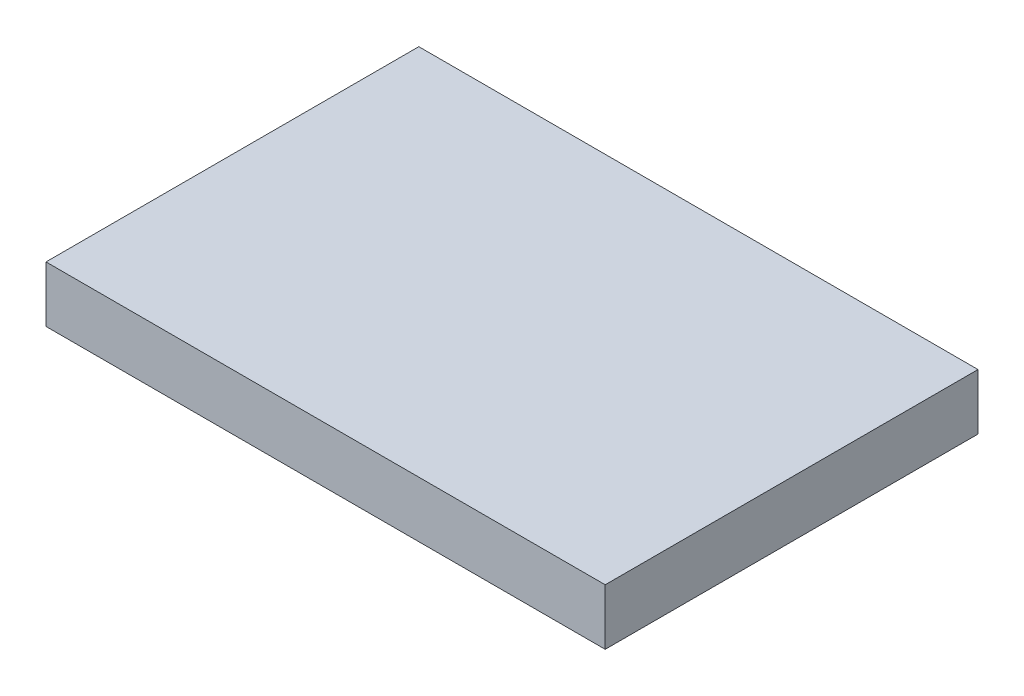
ISO-10303-21;
HEADER;
FILE_DESCRIPTION(('STEP AP214'),'2;1');
FILE_NAME('part.step','',(''),(''),'','','');
FILE_SCHEMA(('AUTOMOTIVE_DESIGN { 1 0 10303 214 1 1 1 1 }'));
ENDSEC;
DATA;
#1=APPLICATION_CONTEXT('core data for automotive mechanical design processes');
#2=APPLICATION_PROTOCOL_DEFINITION('international standard','automotive_design',2000,#1);
#3=PRODUCT_CONTEXT('',#1,'mechanical');
#4=PRODUCT('Part','Part','',(#3));
#5=PRODUCT_RELATED_PRODUCT_CATEGORY('part','',(#4));
#6=PRODUCT_DEFINITION_FORMATION('','',#4);
#7=PRODUCT_DEFINITION_CONTEXT('part definition',#1,'design');
#8=PRODUCT_DEFINITION('design','',#6,#7);
#9=PRODUCT_DEFINITION_SHAPE('','',#8);
#10=(LENGTH_UNIT() NAMED_UNIT(*) SI_UNIT(.MILLI.,.METRE.));
#11=(NAMED_UNIT(*) PLANE_ANGLE_UNIT() SI_UNIT($,.RADIAN.));
#12=(NAMED_UNIT(*) SI_UNIT($,.STERADIAN.) SOLID_ANGLE_UNIT());
#13=UNCERTAINTY_MEASURE_WITH_UNIT(LENGTH_MEASURE(1.E-05),#10,'distance_accuracy_value','');
#14=(GEOMETRIC_REPRESENTATION_CONTEXT(3) GLOBAL_UNCERTAINTY_ASSIGNED_CONTEXT((#13)) GLOBAL_UNIT_ASSIGNED_CONTEXT((#10,
#11,#12)) REPRESENTATION_CONTEXT('',''));
#15=CARTESIAN_POINT('',(0.,0.,0.));
#16=DIRECTION('',(0.,0.,1.));
#17=DIRECTION('',(1.,0.,0.));
#18=AXIS2_PLACEMENT_3D('',#15,#16,#17);
#19=CARTESIAN_POINT('',(-38.0220892526667,3.,4.97529392086932));
#20=DIRECTION('',(1.,0.,0.));
#21=DIRECTION('',(0.,0.,-1.));
#22=AXIS2_PLACEMENT_3D('',#19,#20,#21);
#23=PLANE('',#22);
#24=DIRECTION('',(0.,0.,1.));
#25=VECTOR('',#24,1.);
#26=CARTESIAN_POINT('',(-38.0220892526667,0.,4.97529392086932));
#27=LINE('',#26,#25);
#28=CARTESIAN_POINT('',(-38.0220892526667,0.,4.97529392086932));
#29=VERTEX_POINT('',#28);
#30=CARTESIAN_POINT('',(-38.0220892526667,0.,24.9752939208693));
#31=VERTEX_POINT('',#30);
#32=EDGE_CURVE('E93',#29,#31,#27,.T.);
#33=ORIENTED_EDGE('',*,*,#32,.T.);
#34=DIRECTION('',(0.,-1.,0.));
#35=VECTOR('',#34,1.);
#36=CARTESIAN_POINT('',(-38.0220892526667,3.,24.9752939208693));
#37=LINE('',#36,#35);
#38=CARTESIAN_POINT('',(-38.0220892526667,3.,24.9752939208693));
#39=VERTEX_POINT('',#38);
#40=EDGE_CURVE('E11',#39,#31,#37,.T.);
#41=ORIENTED_EDGE('',*,*,#40,.F.);
#42=DIRECTION('',(0.,0.,1.));
#43=VECTOR('',#42,1.);
#44=CARTESIAN_POINT('',(-38.0220892526667,3.,4.97529392086932));
#45=LINE('',#44,#43);
#46=CARTESIAN_POINT('',(-38.0220892526667,3.,4.97529392086932));
#47=VERTEX_POINT('',#46);
#48=EDGE_CURVE('E81',#47,#39,#45,.T.);
#49=ORIENTED_EDGE('',*,*,#48,.F.);
#50=DIRECTION('',(0.,-1.,0.));
#51=VECTOR('',#50,1.);
#52=CARTESIAN_POINT('',(-38.0220892526667,3.,4.97529392086932));
#53=LINE('',#52,#51);
#54=EDGE_CURVE('E89',#47,#29,#53,.T.);
#55=ORIENTED_EDGE('',*,*,#54,.T.);
#56=EDGE_LOOP('',(#33,#41,#49,#55));
#57=FACE_BOUND('',#56,.T.);
#58=ADVANCED_FACE('F30',(#57),#23,.F.);
#59=CARTESIAN_POINT('',(-38.0220892526667,3.,24.9752939208693));
#60=DIRECTION('',(0.,0.,-1.));
#61=DIRECTION('',(-1.,0.,0.));
#62=AXIS2_PLACEMENT_3D('',#59,#60,#61);
#63=PLANE('',#62);
#64=DIRECTION('',(1.,0.,0.));
#65=VECTOR('',#64,1.);
#66=CARTESIAN_POINT('',(-38.0220892526667,0.,24.9752939208693));
#67=LINE('',#66,#65);
#68=CARTESIAN_POINT('',(-8.02208925266672,0.,24.9752939208693));
#69=VERTEX_POINT('',#68);
#70=EDGE_CURVE('E85',#31,#69,#67,.T.);
#71=ORIENTED_EDGE('',*,*,#70,.T.);
#72=DIRECTION('',(0.,-1.,0.));
#73=VECTOR('',#72,1.);
#74=CARTESIAN_POINT('',(-8.02208925266672,3.,24.9752939208693));
#75=LINE('',#74,#73);
#76=CARTESIAN_POINT('',(-8.02208925266672,3.,24.9752939208693));
#77=VERTEX_POINT('',#76);
#78=EDGE_CURVE('E38',#77,#69,#75,.T.);
#79=ORIENTED_EDGE('',*,*,#78,.F.);
#80=DIRECTION('',(1.,0.,0.));
#81=VECTOR('',#80,1.);
#82=CARTESIAN_POINT('',(-38.0220892526667,3.,24.9752939208693));
#83=LINE('',#82,#81);
#84=EDGE_CURVE('E76',#39,#77,#83,.T.);
#85=ORIENTED_EDGE('',*,*,#84,.F.);
#86=ORIENTED_EDGE('',*,*,#40,.T.);
#87=EDGE_LOOP('',(#71,#79,#85,#86));
#88=FACE_BOUND('',#87,.T.);
#89=ADVANCED_FACE('F84',(#88),#63,.F.);
#90=CARTESIAN_POINT('',(-8.02208925266673,3.,4.97529392086932));
#91=DIRECTION('',(-1.,0.,0.));
#92=DIRECTION('',(0.,0.,1.));
#93=AXIS2_PLACEMENT_3D('',#90,#91,#92);
#94=PLANE('',#93);
#95=DIRECTION('',(0.,0.,-1.));
#96=VECTOR('',#95,1.);
#97=CARTESIAN_POINT('',(-8.02208925266673,0.,4.97529392086932));
#98=LINE('',#97,#96);
#99=CARTESIAN_POINT('',(-8.02208925266673,0.,4.97529392086932));
#100=VERTEX_POINT('',#99);
#101=EDGE_CURVE('E63',#69,#100,#98,.T.);
#102=ORIENTED_EDGE('',*,*,#101,.T.);
#103=DIRECTION('',(0.,-1.,0.));
#104=VECTOR('',#103,1.);
#105=CARTESIAN_POINT('',(-8.02208925266673,3.,4.97529392086932));
#106=LINE('',#105,#104);
#107=CARTESIAN_POINT('',(-8.02208925266673,3.,4.97529392086932));
#108=VERTEX_POINT('',#107);
#109=EDGE_CURVE('E86',#108,#100,#106,.T.);
#110=ORIENTED_EDGE('',*,*,#109,.F.);
#111=DIRECTION('',(0.,0.,-1.));
#112=VECTOR('',#111,1.);
#113=CARTESIAN_POINT('',(-8.02208925266673,3.,4.97529392086932));
#114=LINE('',#113,#112);
#115=EDGE_CURVE('E79',#77,#108,#114,.T.);
#116=ORIENTED_EDGE('',*,*,#115,.F.);
#117=ORIENTED_EDGE('',*,*,#78,.T.);
#118=EDGE_LOOP('',(#102,#110,#116,#117));
#119=FACE_BOUND('',#118,.T.);
#120=ADVANCED_FACE('F87',(#119),#94,.F.);
#121=CARTESIAN_POINT('',(-38.0220892526667,3.,4.97529392086932));
#122=DIRECTION('',(0.,0.,1.));
#123=DIRECTION('',(1.,0.,0.));
#124=AXIS2_PLACEMENT_3D('',#121,#122,#123);
#125=PLANE('',#124);
#126=DIRECTION('',(-1.,0.,0.));
#127=VECTOR('',#126,1.);
#128=CARTESIAN_POINT('',(-38.0220892526667,0.,4.97529392086932));
#129=LINE('',#128,#127);
#130=EDGE_CURVE('E69',#100,#29,#129,.T.);
#131=ORIENTED_EDGE('',*,*,#130,.T.);
#132=ORIENTED_EDGE('',*,*,#54,.F.);
#133=DIRECTION('',(-1.,0.,0.));
#134=VECTOR('',#133,1.);
#135=CARTESIAN_POINT('',(-38.0220892526667,3.,4.97529392086932));
#136=LINE('',#135,#134);
#137=EDGE_CURVE('E46',#108,#47,#136,.T.);
#138=ORIENTED_EDGE('',*,*,#137,.F.);
#139=ORIENTED_EDGE('',*,*,#109,.T.);
#140=EDGE_LOOP('',(#131,#132,#138,#139));
#141=FACE_BOUND('',#140,.T.);
#142=ADVANCED_FACE('F100',(#141),#125,.F.);
#143=CARTESIAN_POINT('',(-38.0220892526667,3.,24.9752939208693));
#144=DIRECTION('',(0.,1.,0.));
#145=DIRECTION('',(0.,0.,1.));
#146=AXIS2_PLACEMENT_3D('',#143,#144,#145);
#147=PLANE('',#146);
#148=ORIENTED_EDGE('',*,*,#48,.T.);
#149=ORIENTED_EDGE('',*,*,#84,.T.);
#150=ORIENTED_EDGE('',*,*,#115,.T.);
#151=ORIENTED_EDGE('',*,*,#137,.T.);
#152=EDGE_LOOP('',(#148,#149,#150,#151));
#153=FACE_BOUND('',#152,.T.);
#154=ADVANCED_FACE('F77',(#153),#147,.T.);
#155=CARTESIAN_POINT('',(-38.0220892526667,0.,24.9752939208693));
#156=DIRECTION('',(0.,1.,0.));
#157=DIRECTION('',(0.,0.,1.));
#158=AXIS2_PLACEMENT_3D('',#155,#156,#157);
#159=PLANE('',#158);
#160=ORIENTED_EDGE('',*,*,#32,.F.);
#161=ORIENTED_EDGE('',*,*,#130,.F.);
#162=ORIENTED_EDGE('',*,*,#101,.F.);
#163=ORIENTED_EDGE('',*,*,#70,.F.);
#164=EDGE_LOOP('',(#160,#161,#162,#163));
#165=FACE_BOUND('',#164,.T.);
#166=ADVANCED_FACE('F103',(#165),#159,.F.);
#167=CLOSED_SHELL('',(#58,#89,#120,#142,#154,#166));
#168=MANIFOLD_SOLID_BREP('B2',#167);
#169=ADVANCED_BREP_SHAPE_REPRESENTATION('',(#18,#168),#14);
#170=SHAPE_DEFINITION_REPRESENTATION(#9,#169);
ENDSEC;
END-ISO-10303-21;
